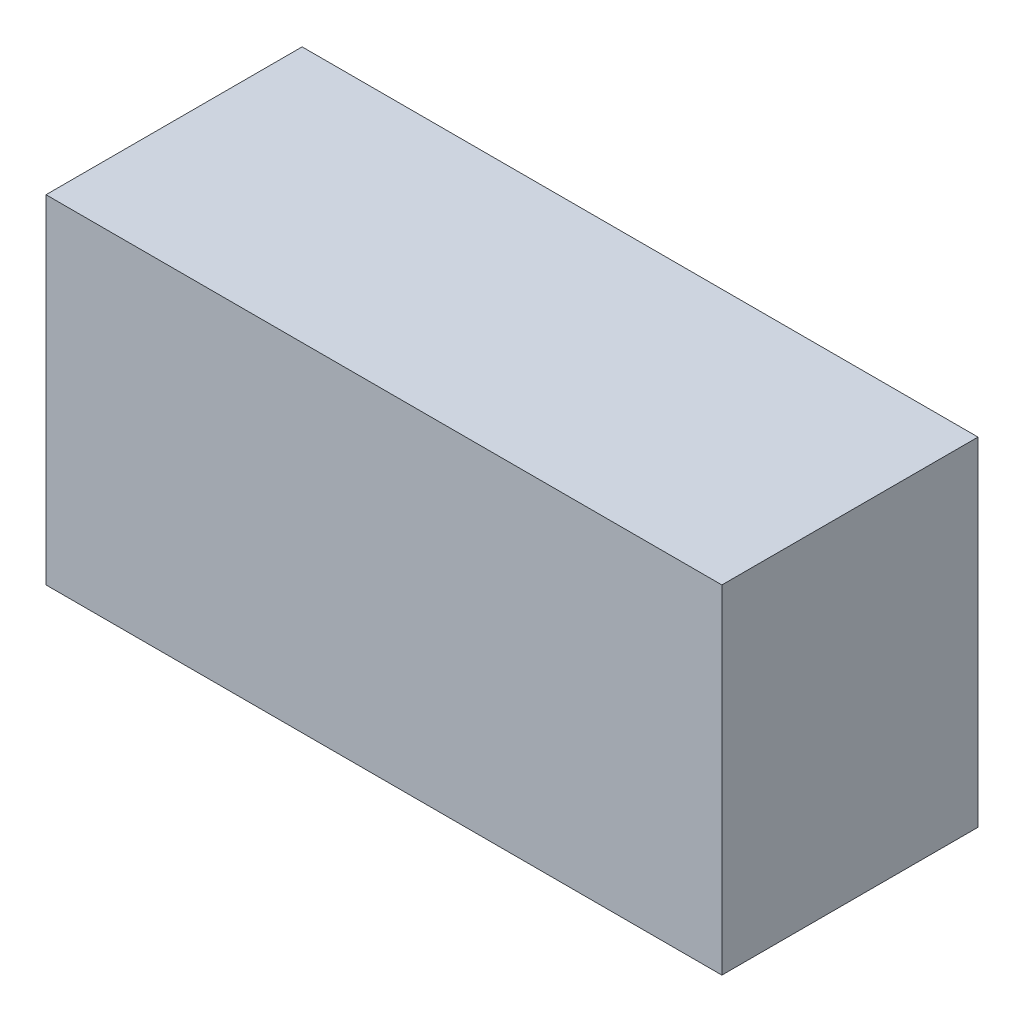
ISO-10303-21;
HEADER;
FILE_DESCRIPTION(('STEP AP214'),'2;1');
FILE_NAME('part.step','',(''),(''),'','','');
FILE_SCHEMA(('AUTOMOTIVE_DESIGN { 1 0 10303 214 1 1 1 1 }'));
ENDSEC;
DATA;
#1=APPLICATION_CONTEXT('core data for automotive mechanical design processes');
#2=APPLICATION_PROTOCOL_DEFINITION('international standard','automotive_design',2000,#1);
#3=PRODUCT_CONTEXT('',#1,'mechanical');
#4=PRODUCT('Part','Part','',(#3));
#5=PRODUCT_RELATED_PRODUCT_CATEGORY('part','',(#4));
#6=PRODUCT_DEFINITION_FORMATION('','',#4);
#7=PRODUCT_DEFINITION_CONTEXT('part definition',#1,'design');
#8=PRODUCT_DEFINITION('design','',#6,#7);
#9=PRODUCT_DEFINITION_SHAPE('','',#8);
#10=(LENGTH_UNIT() NAMED_UNIT(*) SI_UNIT(.MILLI.,.METRE.));
#11=(NAMED_UNIT(*) PLANE_ANGLE_UNIT() SI_UNIT($,.RADIAN.));
#12=(NAMED_UNIT(*) SI_UNIT($,.STERADIAN.) SOLID_ANGLE_UNIT());
#13=UNCERTAINTY_MEASURE_WITH_UNIT(LENGTH_MEASURE(1.E-05),#10,'distance_accuracy_value','');
#14=(GEOMETRIC_REPRESENTATION_CONTEXT(3) GLOBAL_UNCERTAINTY_ASSIGNED_CONTEXT((#13)) GLOBAL_UNIT_ASSIGNED_CONTEXT((#10,
#11,#12)) REPRESENTATION_CONTEXT('',''));
#15=CARTESIAN_POINT('',(0.,0.,0.));
#16=DIRECTION('',(0.,0.,1.));
#17=DIRECTION('',(1.,0.,0.));
#18=AXIS2_PLACEMENT_3D('',#15,#16,#17);
#19=CARTESIAN_POINT('',(50.8,-25.4,38.5));
#20=DIRECTION('',(-1.,0.,0.));
#21=DIRECTION('',(0.,0.,1.));
#22=AXIS2_PLACEMENT_3D('',#19,#20,#21);
#23=PLANE('',#22);
#24=DIRECTION('',(0.,1.,0.));
#25=VECTOR('',#24,1.);
#26=CARTESIAN_POINT('',(50.8,-25.4,0.));
#27=LINE('',#26,#25);
#28=CARTESIAN_POINT('',(50.8,-25.4,0.));
#29=VERTEX_POINT('',#28);
#30=CARTESIAN_POINT('',(50.8,25.4,0.));
#31=VERTEX_POINT('',#30);
#32=EDGE_CURVE('E107',#29,#31,#27,.T.);
#33=ORIENTED_EDGE('',*,*,#32,.T.);
#34=DIRECTION('',(0.,0.,-1.));
#35=VECTOR('',#34,1.);
#36=CARTESIAN_POINT('',(50.8,25.4,38.5));
#37=LINE('',#36,#35);
#38=CARTESIAN_POINT('',(50.8,25.4,38.5));
#39=VERTEX_POINT('',#38);
#40=EDGE_CURVE('E11',#39,#31,#37,.T.);
#41=ORIENTED_EDGE('',*,*,#40,.F.);
#42=DIRECTION('',(0.,1.,0.));
#43=VECTOR('',#42,1.);
#44=CARTESIAN_POINT('',(50.8,-25.4,38.5));
#45=LINE('',#44,#43);
#46=CARTESIAN_POINT('',(50.8,-25.4,38.5));
#47=VERTEX_POINT('',#46);
#48=EDGE_CURVE('E91',#47,#39,#45,.T.);
#49=ORIENTED_EDGE('',*,*,#48,.F.);
#50=DIRECTION('',(0.,0.,-1.));
#51=VECTOR('',#50,1.);
#52=CARTESIAN_POINT('',(50.8,-25.4,38.5));
#53=LINE('',#52,#51);
#54=EDGE_CURVE('E103',#47,#29,#53,.T.);
#55=ORIENTED_EDGE('',*,*,#54,.T.);
#56=EDGE_LOOP('',(#33,#41,#49,#55));
#57=FACE_BOUND('',#56,.T.);
#58=ADVANCED_FACE('F39',(#57),#23,.F.);
#59=CARTESIAN_POINT('',(-50.8,25.4,38.5));
#60=DIRECTION('',(0.,-1.,0.));
#61=DIRECTION('',(0.,0.,-1.));
#62=AXIS2_PLACEMENT_3D('',#59,#60,#61);
#63=PLANE('',#62);
#64=DIRECTION('',(-1.,0.,0.));
#65=VECTOR('',#64,1.);
#66=CARTESIAN_POINT('',(-50.8,25.4,0.));
#67=LINE('',#66,#65);
#68=CARTESIAN_POINT('',(-50.8,25.4,0.));
#69=VERTEX_POINT('',#68);
#70=EDGE_CURVE('E96',#31,#69,#67,.T.);
#71=ORIENTED_EDGE('',*,*,#70,.T.);
#72=DIRECTION('',(0.,0.,-1.));
#73=VECTOR('',#72,1.);
#74=CARTESIAN_POINT('',(-50.8,25.4,38.5));
#75=LINE('',#74,#73);
#76=CARTESIAN_POINT('',(-50.8,25.4,38.5));
#77=VERTEX_POINT('',#76);
#78=EDGE_CURVE('E48',#77,#69,#75,.T.);
#79=ORIENTED_EDGE('',*,*,#78,.F.);
#80=DIRECTION('',(-1.,0.,0.));
#81=VECTOR('',#80,1.);
#82=CARTESIAN_POINT('',(-50.8,25.4,38.5));
#83=LINE('',#82,#81);
#84=EDGE_CURVE('E86',#39,#77,#83,.T.);
#85=ORIENTED_EDGE('',*,*,#84,.F.);
#86=ORIENTED_EDGE('',*,*,#40,.T.);
#87=EDGE_LOOP('',(#71,#79,#85,#86));
#88=FACE_BOUND('',#87,.T.);
#89=ADVANCED_FACE('F95',(#88),#63,.F.);
#90=CARTESIAN_POINT('',(-50.8,-25.4,38.5));
#91=DIRECTION('',(1.,0.,0.));
#92=DIRECTION('',(0.,0.,-1.));
#93=AXIS2_PLACEMENT_3D('',#90,#91,#92);
#94=PLANE('',#93);
#95=DIRECTION('',(0.,-1.,0.));
#96=VECTOR('',#95,1.);
#97=CARTESIAN_POINT('',(-50.8,-25.4,0.));
#98=LINE('',#97,#96);
#99=CARTESIAN_POINT('',(-50.8,-25.4,0.));
#100=VERTEX_POINT('',#99);
#101=EDGE_CURVE('E73',#69,#100,#98,.T.);
#102=ORIENTED_EDGE('',*,*,#101,.T.);
#103=DIRECTION('',(0.,0.,-1.));
#104=VECTOR('',#103,1.);
#105=CARTESIAN_POINT('',(-50.8,-25.4,38.5));
#106=LINE('',#105,#104);
#107=CARTESIAN_POINT('',(-50.8,-25.4,38.5));
#108=VERTEX_POINT('',#107);
#109=EDGE_CURVE('E98',#108,#100,#106,.T.);
#110=ORIENTED_EDGE('',*,*,#109,.F.);
#111=DIRECTION('',(0.,-1.,0.));
#112=VECTOR('',#111,1.);
#113=CARTESIAN_POINT('',(-50.8,-25.4,38.5));
#114=LINE('',#113,#112);
#115=EDGE_CURVE('E89',#77,#108,#114,.T.);
#116=ORIENTED_EDGE('',*,*,#115,.F.);
#117=ORIENTED_EDGE('',*,*,#78,.T.);
#118=EDGE_LOOP('',(#102,#110,#116,#117));
#119=FACE_BOUND('',#118,.T.);
#120=ADVANCED_FACE('F99',(#119),#94,.F.);
#121=CARTESIAN_POINT('',(-50.8,-25.4,38.5));
#122=DIRECTION('',(0.,1.,0.));
#123=DIRECTION('',(0.,0.,1.));
#124=AXIS2_PLACEMENT_3D('',#121,#122,#123);
#125=PLANE('',#124);
#126=DIRECTION('',(1.,0.,0.));
#127=VECTOR('',#126,1.);
#128=CARTESIAN_POINT('',(-50.8,-25.4,0.));
#129=LINE('',#128,#127);
#130=EDGE_CURVE('E79',#100,#29,#129,.T.);
#131=ORIENTED_EDGE('',*,*,#130,.T.);
#132=ORIENTED_EDGE('',*,*,#54,.F.);
#133=DIRECTION('',(1.,0.,0.));
#134=VECTOR('',#133,1.);
#135=CARTESIAN_POINT('',(-50.8,-25.4,38.5));
#136=LINE('',#135,#134);
#137=EDGE_CURVE('E56',#108,#47,#136,.T.);
#138=ORIENTED_EDGE('',*,*,#137,.F.);
#139=ORIENTED_EDGE('',*,*,#109,.T.);
#140=EDGE_LOOP('',(#131,#132,#138,#139));
#141=FACE_BOUND('',#140,.T.);
#142=ADVANCED_FACE('F120',(#141),#125,.F.);
#143=CARTESIAN_POINT('',(0.,0.,38.5));
#144=DIRECTION('',(0.,0.,-1.));
#145=DIRECTION('',(-1.,0.,0.));
#146=AXIS2_PLACEMENT_3D('',#143,#144,#145);
#147=PLANE('',#146);
#148=ORIENTED_EDGE('',*,*,#48,.T.);
#149=ORIENTED_EDGE('',*,*,#84,.T.);
#150=ORIENTED_EDGE('',*,*,#115,.T.);
#151=ORIENTED_EDGE('',*,*,#137,.T.);
#152=EDGE_LOOP('',(#148,#149,#150,#151));
#153=FACE_BOUND('',#152,.T.);
#154=ADVANCED_FACE('F87',(#153),#147,.F.);
#155=CARTESIAN_POINT('',(0.,0.,0.));
#156=DIRECTION('',(0.,0.,-1.));
#157=DIRECTION('',(-1.,0.,0.));
#158=AXIS2_PLACEMENT_3D('',#155,#156,#157);
#159=PLANE('',#158);
#160=ORIENTED_EDGE('',*,*,#32,.F.);
#161=ORIENTED_EDGE('',*,*,#130,.F.);
#162=ORIENTED_EDGE('',*,*,#101,.F.);
#163=ORIENTED_EDGE('',*,*,#70,.F.);
#164=EDGE_LOOP('',(#160,#161,#162,#163));
#165=FACE_BOUND('',#164,.T.);
#166=ADVANCED_FACE('F123',(#165),#159,.T.);
#167=CLOSED_SHELL('',(#58,#89,#120,#142,#154,#166));
#168=MANIFOLD_SOLID_BREP('B2',#167);
#169=ADVANCED_BREP_SHAPE_REPRESENTATION('',(#18,#168),#14);
#170=SHAPE_DEFINITION_REPRESENTATION(#9,#169);
ENDSEC;
END-ISO-10303-21;
